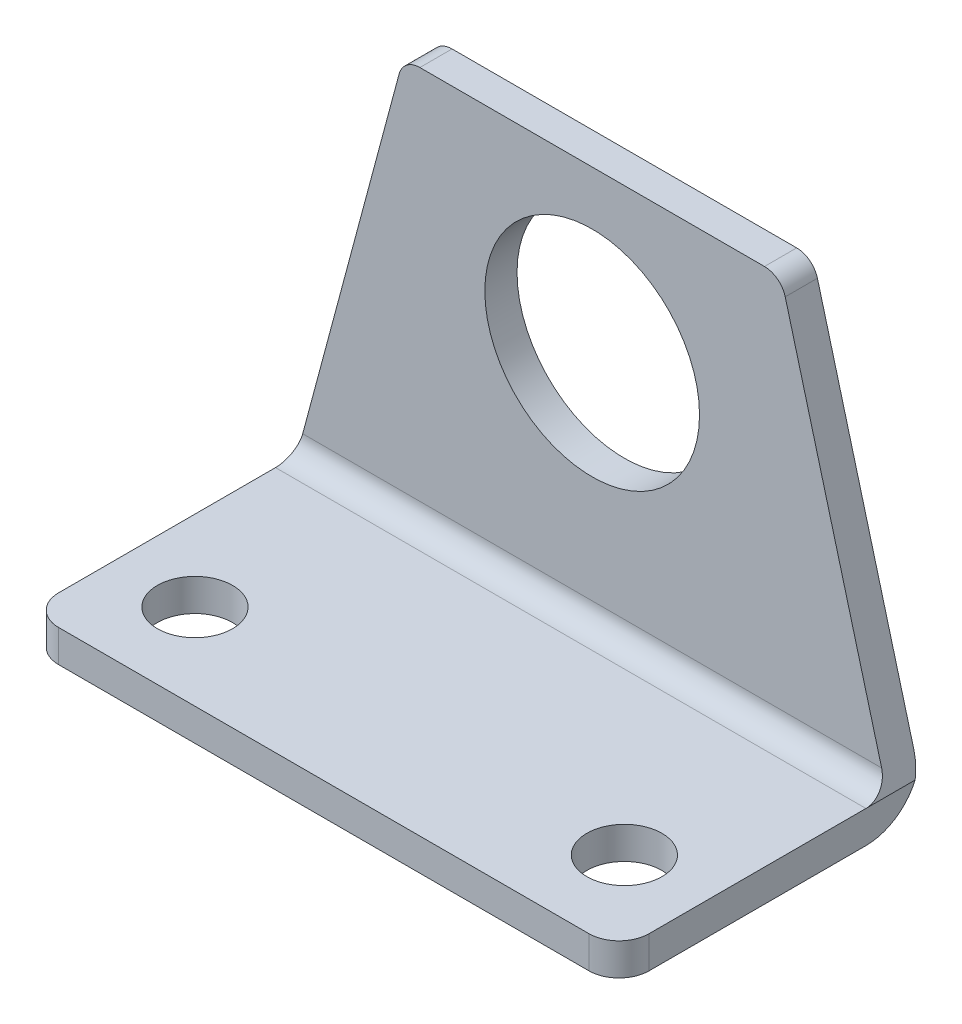
ISO-10303-21;
HEADER;
FILE_DESCRIPTION(('STEP AP214'),'2;1');
FILE_NAME('part.step','',(''),(''),'','','');
FILE_SCHEMA(('AUTOMOTIVE_DESIGN { 1 0 10303 214 1 1 1 1 }'));
ENDSEC;
DATA;
#1=APPLICATION_CONTEXT('core data for automotive mechanical design processes');
#2=APPLICATION_PROTOCOL_DEFINITION('international standard','automotive_design',2000,#1);
#3=PRODUCT_CONTEXT('',#1,'mechanical');
#4=PRODUCT('Part','Part','',(#3));
#5=PRODUCT_RELATED_PRODUCT_CATEGORY('part','',(#4));
#6=PRODUCT_DEFINITION_FORMATION('','',#4);
#7=PRODUCT_DEFINITION_CONTEXT('part definition',#1,'design');
#8=PRODUCT_DEFINITION('design','',#6,#7);
#9=PRODUCT_DEFINITION_SHAPE('','',#8);
#10=(LENGTH_UNIT() NAMED_UNIT(*) SI_UNIT(.MILLI.,.METRE.));
#11=(NAMED_UNIT(*) PLANE_ANGLE_UNIT() SI_UNIT($,.RADIAN.));
#12=(NAMED_UNIT(*) SI_UNIT($,.STERADIAN.) SOLID_ANGLE_UNIT());
#13=UNCERTAINTY_MEASURE_WITH_UNIT(LENGTH_MEASURE(1.E-05),#10,'distance_accuracy_value','');
#14=(GEOMETRIC_REPRESENTATION_CONTEXT(3) GLOBAL_UNCERTAINTY_ASSIGNED_CONTEXT((#13)) GLOBAL_UNIT_ASSIGNED_CONTEXT((#10,
#11,#12)) REPRESENTATION_CONTEXT('',''));
#15=CARTESIAN_POINT('',(0.,0.,0.));
#16=DIRECTION('',(0.,0.,1.));
#17=DIRECTION('',(1.,0.,0.));
#18=AXIS2_PLACEMENT_3D('',#15,#16,#17);
#19=CARTESIAN_POINT('',(-27.5,0.,28.));
#20=DIRECTION('',(0.,0.,1.));
#21=DIRECTION('',(1.,0.,0.));
#22=AXIS2_PLACEMENT_3D('',#19,#20,#21);
#23=PLANE('',#22);
#24=DIRECTION('',(1.,0.,0.));
#25=VECTOR('',#24,1.);
#26=CARTESIAN_POINT('',(-27.5,0.,28.));
#27=LINE('',#26,#25);
#28=CARTESIAN_POINT('',(-24.7,0.,28.));
#29=VERTEX_POINT('',#28);
#30=CARTESIAN_POINT('',(24.7,0.,28.));
#31=VERTEX_POINT('',#30);
#32=EDGE_CURVE('E166',#29,#31,#27,.T.);
#33=ORIENTED_EDGE('',*,*,#32,.T.);
#34=DIRECTION('',(0.,-1.,0.));
#35=VECTOR('',#34,1.);
#36=CARTESIAN_POINT('',(24.7,0.,28.));
#37=LINE('',#36,#35);
#38=CARTESIAN_POINT('',(24.7,3.,28.));
#39=VERTEX_POINT('',#38);
#40=EDGE_CURVE('E54',#31,#39,#37,.F.);
#41=ORIENTED_EDGE('',*,*,#40,.T.);
#42=DIRECTION('',(1.,0.,0.));
#43=VECTOR('',#42,1.);
#44=CARTESIAN_POINT('',(-27.5,3.,28.));
#45=LINE('',#44,#43);
#46=CARTESIAN_POINT('',(-24.7,3.,28.));
#47=VERTEX_POINT('',#46);
#48=EDGE_CURVE('E175',#47,#39,#45,.T.);
#49=ORIENTED_EDGE('',*,*,#48,.F.);
#50=DIRECTION('',(0.,-1.,0.));
#51=VECTOR('',#50,1.);
#52=CARTESIAN_POINT('',(-24.7,0.,28.));
#53=LINE('',#52,#51);
#54=EDGE_CURVE('E201',#47,#29,#53,.T.);
#55=ORIENTED_EDGE('',*,*,#54,.T.);
#56=EDGE_LOOP('',(#33,#41,#49,#55));
#57=FACE_BOUND('',#56,.T.);
#58=ADVANCED_FACE('F33',(#57),#23,.T.);
#59=CARTESIAN_POINT('',(-27.5,3.,28.));
#60=DIRECTION('',(0.,1.,0.));
#61=DIRECTION('',(0.,0.,1.));
#62=AXIS2_PLACEMENT_3D('',#59,#60,#61);
#63=PLANE('',#62);
#64=CARTESIAN_POINT('',(20.,3.,20.));
#65=DIRECTION('',(0.,1.,0.));
#66=DIRECTION('',(0.,0.,-1.));
#67=AXIS2_PLACEMENT_3D('',#64,#65,#66);
#68=CIRCLE('',#67,3.5);
#69=CARTESIAN_POINT('',(20.,3.,16.5));
#70=VERTEX_POINT('',#69);
#71=EDGE_CURVE('E452',#70,#70,#68,.T.);
#72=ORIENTED_EDGE('',*,*,#71,.F.);
#73=EDGE_LOOP('',(#72));
#74=FACE_BOUND('',#73,.T.);
#75=CARTESIAN_POINT('',(-20.,3.,20.));
#76=DIRECTION('',(0.,1.,0.));
#77=DIRECTION('',(0.,0.,1.));
#78=AXIS2_PLACEMENT_3D('',#75,#76,#77);
#79=CIRCLE('',#78,3.5);
#80=CARTESIAN_POINT('',(-20.,3.,23.5));
#81=VERTEX_POINT('',#80);
#82=EDGE_CURVE('E266',#81,#81,#79,.T.);
#83=ORIENTED_EDGE('',*,*,#82,.F.);
#84=EDGE_LOOP('',(#83));
#85=FACE_BOUND('',#84,.T.);
#86=ORIENTED_EDGE('',*,*,#48,.T.);
#87=CARTESIAN_POINT('',(24.7,3.,25.2));
#88=DIRECTION('',(0.,1.,0.));
#89=DIRECTION('',(0.,0.,1.));
#90=AXIS2_PLACEMENT_3D('',#87,#88,#89);
#91=CIRCLE('',#90,2.8);
#92=CARTESIAN_POINT('',(27.5,3.,25.2));
#93=VERTEX_POINT('',#92);
#94=EDGE_CURVE('E41',#39,#93,#91,.T.);
#95=ORIENTED_EDGE('',*,*,#94,.T.);
#96=DIRECTION('',(0.,0.,1.));
#97=VECTOR('',#96,1.);
#98=CARTESIAN_POINT('',(27.5,3.,28.));
#99=LINE('',#98,#97);
#100=CARTESIAN_POINT('',(27.5,3.,5.));
#101=VERTEX_POINT('',#100);
#102=EDGE_CURVE('E212',#101,#93,#99,.T.);
#103=ORIENTED_EDGE('',*,*,#102,.F.);
#104=DIRECTION('',(1.,0.,0.));
#105=VECTOR('',#104,1.);
#106=CARTESIAN_POINT('',(-27.5,3.,5.));
#107=LINE('',#106,#105);
#108=CARTESIAN_POINT('',(-27.5,3.,5.));
#109=VERTEX_POINT('',#108);
#110=EDGE_CURVE('E244',#109,#101,#107,.T.);
#111=ORIENTED_EDGE('',*,*,#110,.F.);
#112=DIRECTION('',(0.,0.,1.));
#113=VECTOR('',#112,1.);
#114=CARTESIAN_POINT('',(-27.5,3.,28.));
#115=LINE('',#114,#113);
#116=CARTESIAN_POINT('',(-27.5,3.,25.2));
#117=VERTEX_POINT('',#116);
#118=EDGE_CURVE('E171',#109,#117,#115,.T.);
#119=ORIENTED_EDGE('',*,*,#118,.T.);
#120=CARTESIAN_POINT('',(-24.7,3.,25.2));
#121=DIRECTION('',(0.,1.,0.));
#122=DIRECTION('',(0.,0.,1.));
#123=AXIS2_PLACEMENT_3D('',#120,#121,#122);
#124=CIRCLE('',#123,2.8);
#125=EDGE_CURVE('E205',#117,#47,#124,.T.);
#126=ORIENTED_EDGE('',*,*,#125,.T.);
#127=EDGE_LOOP('',(#86,#95,#103,#111,#119,#126));
#128=FACE_BOUND('',#127,.T.);
#129=ADVANCED_FACE('F210',(#74,#85,#128),#63,.T.);
#130=CARTESIAN_POINT('',(-27.5,5.,5.));
#131=DIRECTION('',(1.,0.,0.));
#132=DIRECTION('',(0.,0.,-1.));
#133=AXIS2_PLACEMENT_3D('',#130,#131,#132);
#134=CYLINDRICAL_SURFACE('',#133,2.);
#135=CARTESIAN_POINT('',(-26.9641016151378,5.,5.));
#136=DIRECTION('',(0.965925826289068,-0.258819045102521,0.));
#137=DIRECTION('',(0.258819045102521,0.965925826289068,0.));
#138=AXIS2_PLACEMENT_3D('',#135,#136,#137);
#139=ELLIPSE('',#138,2.07055236082017,2.);
#140=CARTESIAN_POINT('',(-26.9641016151378,5.,3.));
#141=VERTEX_POINT('',#140);
#142=EDGE_CURVE('E275',#109,#141,#139,.T.);
#143=ORIENTED_EDGE('',*,*,#142,.F.);
#144=ORIENTED_EDGE('',*,*,#110,.T.);
#145=CARTESIAN_POINT('',(26.9641016151377,5.,5.));
#146=DIRECTION('',(-0.965925826289068,-0.258819045102521,0.));
#147=DIRECTION('',(0.258819045102521,-0.965925826289068,0.));
#148=AXIS2_PLACEMENT_3D('',#145,#146,#147);
#149=ELLIPSE('',#148,2.07055236082017,2.);
#150=CARTESIAN_POINT('',(26.9641016151377,5.,3.));
#151=VERTEX_POINT('',#150);
#152=EDGE_CURVE('E153',#151,#101,#149,.T.);
#153=ORIENTED_EDGE('',*,*,#152,.F.);
#154=DIRECTION('',(1.,0.,0.));
#155=VECTOR('',#154,1.);
#156=CARTESIAN_POINT('',(-27.5,5.,3.));
#157=LINE('',#156,#155);
#158=EDGE_CURVE('E246',#141,#151,#157,.T.);
#159=ORIENTED_EDGE('',*,*,#158,.F.);
#160=EDGE_LOOP('',(#143,#144,#153,#159));
#161=FACE_BOUND('',#160,.T.);
#162=ADVANCED_FACE('F285',(#161),#134,.F.);
#163=CARTESIAN_POINT('',(-27.5,5.,3.));
#164=DIRECTION('',(0.,0.,1.));
#165=DIRECTION('',(1.,0.,0.));
#166=AXIS2_PLACEMENT_3D('',#163,#164,#165);
#167=PLANE('',#166);
#168=DIRECTION('',(0.258819045102521,-0.965925826289068,0.));
#169=VECTOR('',#168,1.);
#170=CARTESIAN_POINT('',(23.315698604072,18.6160254037845,3.));
#171=LINE('',#170,#169);
#172=CARTESIAN_POINT('',(17.9830775566686,38.517638090205,3.));
#173=VERTEX_POINT('',#172);
#174=EDGE_CURVE('E271',#173,#151,#171,.T.);
#175=ORIENTED_EDGE('',*,*,#174,.F.);
#176=CARTESIAN_POINT('',(16.0512259040905,38.,3.));
#177=DIRECTION('',(0.,0.,1.));
#178=DIRECTION('',(1.,0.,0.));
#179=AXIS2_PLACEMENT_3D('',#176,#177,#178);
#180=CIRCLE('',#179,2.);
#181=CARTESIAN_POINT('',(16.0512259040905,40.,3.));
#182=VERTEX_POINT('',#181);
#183=EDGE_CURVE('E182',#173,#182,#180,.T.);
#184=ORIENTED_EDGE('',*,*,#183,.T.);
#185=DIRECTION('',(1.,0.,0.));
#186=VECTOR('',#185,1.);
#187=CARTESIAN_POINT('',(-27.5,40.,3.));
#188=LINE('',#187,#186);
#189=CARTESIAN_POINT('',(-16.0512259040905,40.,3.));
#190=VERTEX_POINT('',#189);
#191=EDGE_CURVE('E163',#190,#182,#188,.T.);
#192=ORIENTED_EDGE('',*,*,#191,.F.);
#193=CARTESIAN_POINT('',(-16.0512259040905,38.,3.));
#194=DIRECTION('',(0.,0.,1.));
#195=DIRECTION('',(1.,0.,0.));
#196=AXIS2_PLACEMENT_3D('',#193,#194,#195);
#197=CIRCLE('',#196,2.);
#198=CARTESIAN_POINT('',(-17.9830775566687,38.5176380902051,3.));
#199=VERTEX_POINT('',#198);
#200=EDGE_CURVE('E180',#190,#199,#197,.T.);
#201=ORIENTED_EDGE('',*,*,#200,.T.);
#202=DIRECTION('',(0.258819045102521,0.965925826289068,0.));
#203=VECTOR('',#202,1.);
#204=CARTESIAN_POINT('',(-27.,4.86602540378444,3.));
#205=LINE('',#204,#203);
#206=EDGE_CURVE('E152',#141,#199,#205,.T.);
#207=ORIENTED_EDGE('',*,*,#206,.F.);
#208=ORIENTED_EDGE('',*,*,#158,.T.);
#209=EDGE_LOOP('',(#175,#184,#192,#201,#207,#208));
#210=FACE_BOUND('',#209,.T.);
#211=CARTESIAN_POINT('',(0.,25.,3.));
#212=DIRECTION('',(0.,0.,1.));
#213=DIRECTION('',(1.,0.,0.));
#214=AXIS2_PLACEMENT_3D('',#211,#212,#213);
#215=CIRCLE('',#214,10.);
#216=CARTESIAN_POINT('',(10.,25.,3.));
#217=VERTEX_POINT('',#216);
#218=EDGE_CURVE('E236',#217,#217,#215,.T.);
#219=ORIENTED_EDGE('',*,*,#218,.F.);
#220=EDGE_LOOP('',(#219));
#221=FACE_BOUND('',#220,.T.);
#222=ADVANCED_FACE('F283',(#210,#221),#167,.T.);
#223=CARTESIAN_POINT('',(-27.5,40.,3.));
#224=DIRECTION('',(0.,1.,0.));
#225=DIRECTION('',(0.,0.,1.));
#226=AXIS2_PLACEMENT_3D('',#223,#224,#225);
#227=PLANE('',#226);
#228=ORIENTED_EDGE('',*,*,#191,.T.);
#229=DIRECTION('',(0.,0.,1.));
#230=VECTOR('',#229,1.);
#231=CARTESIAN_POINT('',(16.0512259040905,40.,0.));
#232=LINE('',#231,#230);
#233=CARTESIAN_POINT('',(16.0512259040905,40.,0.));
#234=VERTEX_POINT('',#233);
#235=EDGE_CURVE('E187',#182,#234,#232,.F.);
#236=ORIENTED_EDGE('',*,*,#235,.T.);
#237=DIRECTION('',(1.,0.,0.));
#238=VECTOR('',#237,1.);
#239=CARTESIAN_POINT('',(-27.5,40.,0.));
#240=LINE('',#239,#238);
#241=CARTESIAN_POINT('',(-16.0512259040905,40.,0.));
#242=VERTEX_POINT('',#241);
#243=EDGE_CURVE('E160',#242,#234,#240,.T.);
#244=ORIENTED_EDGE('',*,*,#243,.F.);
#245=DIRECTION('',(0.,0.,1.));
#246=VECTOR('',#245,1.);
#247=CARTESIAN_POINT('',(-16.0512259040905,40.,3.));
#248=LINE('',#247,#246);
#249=EDGE_CURVE('E184',#242,#190,#248,.T.);
#250=ORIENTED_EDGE('',*,*,#249,.T.);
#251=EDGE_LOOP('',(#228,#236,#244,#250));
#252=FACE_BOUND('',#251,.T.);
#253=ADVANCED_FACE('F252',(#252),#227,.T.);
#254=CARTESIAN_POINT('',(-27.5,5.,0.));
#255=DIRECTION('',(0.,0.,-1.));
#256=DIRECTION('',(-1.,0.,0.));
#257=AXIS2_PLACEMENT_3D('',#254,#255,#256);
#258=PLANE('',#257);
#259=ORIENTED_EDGE('',*,*,#243,.T.);
#260=CARTESIAN_POINT('',(16.0512259040905,38.,0.));
#261=DIRECTION('',(0.,0.,-1.));
#262=DIRECTION('',(-1.,0.,0.));
#263=AXIS2_PLACEMENT_3D('',#260,#261,#262);
#264=CIRCLE('',#263,2.);
#265=CARTESIAN_POINT('',(17.9830775566687,38.517638090205,0.));
#266=VERTEX_POINT('',#265);
#267=EDGE_CURVE('E191',#234,#266,#264,.T.);
#268=ORIENTED_EDGE('',*,*,#267,.T.);
#269=DIRECTION('',(0.258819045102521,-0.965925826289068,0.));
#270=VECTOR('',#269,1.);
#271=CARTESIAN_POINT('',(17.5858798800484,40.,0.));
#272=LINE('',#271,#270);
#273=CARTESIAN_POINT('',(26.9641016151377,5.,0.));
#274=VERTEX_POINT('',#273);
#275=EDGE_CURVE('E141',#266,#274,#272,.T.);
#276=ORIENTED_EDGE('',*,*,#275,.T.);
#277=DIRECTION('',(1.,0.,0.));
#278=VECTOR('',#277,1.);
#279=CARTESIAN_POINT('',(-27.5,5.,0.));
#280=LINE('',#279,#278);
#281=CARTESIAN_POINT('',(-26.9641016151377,5.,0.));
#282=VERTEX_POINT('',#281);
#283=EDGE_CURVE('E148',#282,#274,#280,.T.);
#284=ORIENTED_EDGE('',*,*,#283,.F.);
#285=DIRECTION('',(0.258819045102521,0.965925826289068,0.));
#286=VECTOR('',#285,1.);
#287=CARTESIAN_POINT('',(-17.5858798800484,40.,0.));
#288=LINE('',#287,#286);
#289=CARTESIAN_POINT('',(-17.9830775566687,38.517638090205,0.));
#290=VERTEX_POINT('',#289);
#291=EDGE_CURVE('E129',#282,#290,#288,.T.);
#292=ORIENTED_EDGE('',*,*,#291,.T.);
#293=CARTESIAN_POINT('',(-16.0512259040905,38.,0.));
#294=DIRECTION('',(0.,0.,-1.));
#295=DIRECTION('',(-1.,0.,0.));
#296=AXIS2_PLACEMENT_3D('',#293,#294,#295);
#297=CIRCLE('',#296,2.);
#298=EDGE_CURVE('E189',#290,#242,#297,.T.);
#299=ORIENTED_EDGE('',*,*,#298,.T.);
#300=EDGE_LOOP('',(#259,#268,#276,#284,#292,#299));
#301=FACE_BOUND('',#300,.T.);
#302=CARTESIAN_POINT('',(0.,25.,0.));
#303=DIRECTION('',(0.,0.,1.));
#304=DIRECTION('',(1.,0.,0.));
#305=AXIS2_PLACEMENT_3D('',#302,#303,#304);
#306=CIRCLE('',#305,10.);
#307=CARTESIAN_POINT('',(10.,25.,0.));
#308=VERTEX_POINT('',#307);
#309=EDGE_CURVE('E241',#308,#308,#306,.T.);
#310=ORIENTED_EDGE('',*,*,#309,.T.);
#311=EDGE_LOOP('',(#310));
#312=FACE_BOUND('',#311,.T.);
#313=ADVANCED_FACE('F156',(#301,#312),#258,.T.);
#314=CARTESIAN_POINT('',(-27.5,5.,5.));
#315=DIRECTION('',(1.,0.,0.));
#316=DIRECTION('',(0.,0.,-1.));
#317=AXIS2_PLACEMENT_3D('',#314,#315,#316);
#318=CYLINDRICAL_SURFACE('',#317,5.);
#319=CARTESIAN_POINT('',(-26.9641016151378,5.,5.));
#320=DIRECTION('',(0.965925826289068,-0.258819045102521,0.));
#321=DIRECTION('',(0.258819045102521,0.965925826289068,0.));
#322=AXIS2_PLACEMENT_3D('',#319,#320,#321);
#323=ELLIPSE('',#322,5.17638090205041,5.);
#324=CARTESIAN_POINT('',(-27.5,3.,0.417424305044161));
#325=VERTEX_POINT('',#324);
#326=EDGE_CURVE('E133',#282,#325,#323,.F.);
#327=ORIENTED_EDGE('',*,*,#326,.F.);
#328=ORIENTED_EDGE('',*,*,#283,.T.);
#329=CARTESIAN_POINT('',(26.9641016151377,5.,5.));
#330=DIRECTION('',(-0.965925826289068,-0.258819045102521,0.));
#331=DIRECTION('',(0.258819045102521,-0.965925826289068,0.));
#332=AXIS2_PLACEMENT_3D('',#329,#330,#331);
#333=ELLIPSE('',#332,5.17638090205041,5.);
#334=CARTESIAN_POINT('',(27.5,3.,0.417424305044161));
#335=VERTEX_POINT('',#334);
#336=EDGE_CURVE('E140',#335,#274,#333,.F.);
#337=ORIENTED_EDGE('',*,*,#336,.F.);
#338=CARTESIAN_POINT('',(27.5,5.,5.));
#339=DIRECTION('',(1.,0.,0.));
#340=DIRECTION('',(0.,0.,-1.));
#341=AXIS2_PLACEMENT_3D('',#338,#339,#340);
#342=CIRCLE('',#341,5.);
#343=CARTESIAN_POINT('',(27.5,0.,5.));
#344=VERTEX_POINT('',#343);
#345=EDGE_CURVE('E222',#344,#335,#342,.T.);
#346=ORIENTED_EDGE('',*,*,#345,.F.);
#347=DIRECTION('',(1.,0.,0.));
#348=VECTOR('',#347,1.);
#349=CARTESIAN_POINT('',(-27.5,0.,5.));
#350=LINE('',#349,#348);
#351=CARTESIAN_POINT('',(-27.5,0.,5.));
#352=VERTEX_POINT('',#351);
#353=EDGE_CURVE('E161',#352,#344,#350,.T.);
#354=ORIENTED_EDGE('',*,*,#353,.F.);
#355=CARTESIAN_POINT('',(-27.5,5.,5.));
#356=DIRECTION('',(1.,0.,0.));
#357=DIRECTION('',(0.,0.,-1.));
#358=AXIS2_PLACEMENT_3D('',#355,#356,#357);
#359=CIRCLE('',#358,5.);
#360=EDGE_CURVE('E151',#352,#325,#359,.T.);
#361=ORIENTED_EDGE('',*,*,#360,.T.);
#362=EDGE_LOOP('',(#327,#328,#337,#346,#354,#361));
#363=FACE_BOUND('',#362,.T.);
#364=ADVANCED_FACE('F146',(#363),#318,.T.);
#365=CARTESIAN_POINT('',(-27.5,0.,28.));
#366=DIRECTION('',(0.,-1.,0.));
#367=DIRECTION('',(0.,0.,-1.));
#368=AXIS2_PLACEMENT_3D('',#365,#366,#367);
#369=PLANE('',#368);
#370=CARTESIAN_POINT('',(20.,0.,20.));
#371=DIRECTION('',(0.,1.,0.));
#372=DIRECTION('',(0.,0.,-1.));
#373=AXIS2_PLACEMENT_3D('',#370,#371,#372);
#374=CIRCLE('',#373,3.5);
#375=CARTESIAN_POINT('',(20.,0.,16.5));
#376=VERTEX_POINT('',#375);
#377=EDGE_CURVE('E450',#376,#376,#374,.T.);
#378=ORIENTED_EDGE('',*,*,#377,.T.);
#379=EDGE_LOOP('',(#378));
#380=FACE_BOUND('',#379,.T.);
#381=CARTESIAN_POINT('',(-20.,0.,20.));
#382=DIRECTION('',(0.,1.,0.));
#383=DIRECTION('',(0.,0.,1.));
#384=AXIS2_PLACEMENT_3D('',#381,#382,#383);
#385=CIRCLE('',#384,3.5);
#386=CARTESIAN_POINT('',(-20.,0.,23.5));
#387=VERTEX_POINT('',#386);
#388=EDGE_CURVE('E263',#387,#387,#385,.T.);
#389=ORIENTED_EDGE('',*,*,#388,.T.);
#390=EDGE_LOOP('',(#389));
#391=FACE_BOUND('',#390,.T.);
#392=DIRECTION('',(0.,0.,-1.));
#393=VECTOR('',#392,1.);
#394=CARTESIAN_POINT('',(27.5,0.,28.));
#395=LINE('',#394,#393);
#396=CARTESIAN_POINT('',(27.5,0.,25.2));
#397=VERTEX_POINT('',#396);
#398=EDGE_CURVE('E228',#397,#344,#395,.T.);
#399=ORIENTED_EDGE('',*,*,#398,.F.);
#400=CARTESIAN_POINT('',(24.7,0.,25.2));
#401=DIRECTION('',(0.,-1.,0.));
#402=DIRECTION('',(0.,0.,-1.));
#403=AXIS2_PLACEMENT_3D('',#400,#401,#402);
#404=CIRCLE('',#403,2.8);
#405=EDGE_CURVE('E199',#397,#31,#404,.T.);
#406=ORIENTED_EDGE('',*,*,#405,.T.);
#407=ORIENTED_EDGE('',*,*,#32,.F.);
#408=CARTESIAN_POINT('',(-24.7,0.,25.2));
#409=DIRECTION('',(0.,-1.,0.));
#410=DIRECTION('',(0.,0.,-1.));
#411=AXIS2_PLACEMENT_3D('',#408,#409,#410);
#412=CIRCLE('',#411,2.8);
#413=CARTESIAN_POINT('',(-27.5,0.,25.2));
#414=VERTEX_POINT('',#413);
#415=EDGE_CURVE('E197',#29,#414,#412,.T.);
#416=ORIENTED_EDGE('',*,*,#415,.T.);
#417=DIRECTION('',(0.,0.,-1.));
#418=VECTOR('',#417,1.);
#419=CARTESIAN_POINT('',(-27.5,0.,28.));
#420=LINE('',#419,#418);
#421=EDGE_CURVE('E221',#414,#352,#420,.T.);
#422=ORIENTED_EDGE('',*,*,#421,.T.);
#423=ORIENTED_EDGE('',*,*,#353,.T.);
#424=EDGE_LOOP('',(#399,#406,#407,#416,#422,#423));
#425=FACE_BOUND('',#424,.T.);
#426=ADVANCED_FACE('F227',(#380,#391,#425),#369,.T.);
#427=CARTESIAN_POINT('',(-27.5,5.,5.));
#428=DIRECTION('',(1.,0.,0.));
#429=DIRECTION('',(0.,0.,-1.));
#430=AXIS2_PLACEMENT_3D('',#427,#428,#429);
#431=PLANE('',#430);
#432=ORIENTED_EDGE('',*,*,#421,.F.);
#433=DIRECTION('',(0.,-1.,0.));
#434=VECTOR('',#433,1.);
#435=CARTESIAN_POINT('',(-27.5,3.,25.2));
#436=LINE('',#435,#434);
#437=EDGE_CURVE('E11',#414,#117,#436,.F.);
#438=ORIENTED_EDGE('',*,*,#437,.T.);
#439=ORIENTED_EDGE('',*,*,#118,.F.);
#440=DIRECTION('',(0.,0.,-1.));
#441=VECTOR('',#440,1.);
#442=CARTESIAN_POINT('',(-27.5,3.,5.));
#443=LINE('',#442,#441);
#444=EDGE_CURVE('E174',#109,#325,#443,.T.);
#445=ORIENTED_EDGE('',*,*,#444,.T.);
#446=ORIENTED_EDGE('',*,*,#360,.F.);
#447=EDGE_LOOP('',(#432,#438,#439,#445,#446));
#448=FACE_BOUND('',#447,.T.);
#449=ADVANCED_FACE('F232',(#448),#431,.F.);
#450=CARTESIAN_POINT('',(27.5,5.,5.));
#451=DIRECTION('',(1.,0.,0.));
#452=DIRECTION('',(0.,0.,-1.));
#453=AXIS2_PLACEMENT_3D('',#450,#451,#452);
#454=PLANE('',#453);
#455=ORIENTED_EDGE('',*,*,#102,.T.);
#456=DIRECTION('',(0.,-1.,0.));
#457=VECTOR('',#456,1.);
#458=CARTESIAN_POINT('',(27.5,5.,25.2));
#459=LINE('',#458,#457);
#460=EDGE_CURVE('E194',#93,#397,#459,.T.);
#461=ORIENTED_EDGE('',*,*,#460,.T.);
#462=ORIENTED_EDGE('',*,*,#398,.T.);
#463=ORIENTED_EDGE('',*,*,#345,.T.);
#464=DIRECTION('',(0.,0.,-1.));
#465=VECTOR('',#464,1.);
#466=CARTESIAN_POINT('',(27.5,3.,5.));
#467=LINE('',#466,#465);
#468=EDGE_CURVE('E172',#101,#335,#467,.T.);
#469=ORIENTED_EDGE('',*,*,#468,.F.);
#470=EDGE_LOOP('',(#455,#461,#462,#463,#469));
#471=FACE_BOUND('',#470,.T.);
#472=ADVANCED_FACE('F217',(#471),#454,.T.);
#473=CARTESIAN_POINT('',(0.,25.,0.));
#474=DIRECTION('',(0.,0.,1.));
#475=DIRECTION('',(1.,0.,0.));
#476=AXIS2_PLACEMENT_3D('',#473,#474,#475);
#477=CYLINDRICAL_SURFACE('',#476,10.);
#478=ORIENTED_EDGE('',*,*,#309,.F.);
#479=EDGE_LOOP('',(#478));
#480=FACE_BOUND('',#479,.T.);
#481=ORIENTED_EDGE('',*,*,#218,.T.);
#482=EDGE_LOOP('',(#481));
#483=FACE_BOUND('',#482,.T.);
#484=ADVANCED_FACE('F281',(#480,#483),#477,.F.);
#485=CARTESIAN_POINT('',(17.5858798800484,40.,0.));
#486=DIRECTION('',(-0.965925826289068,-0.258819045102521,0.));
#487=DIRECTION('',(0.258819045102521,-0.965925826289068,0.));
#488=AXIS2_PLACEMENT_3D('',#485,#486,#487);
#489=PLANE('',#488);
#490=ORIENTED_EDGE('',*,*,#275,.F.);
#491=DIRECTION('',(0.,0.,1.));
#492=VECTOR('',#491,1.);
#493=CARTESIAN_POINT('',(17.9830775566687,38.517638090205,3.));
#494=LINE('',#493,#492);
#495=EDGE_CURVE('E177',#266,#173,#494,.T.);
#496=ORIENTED_EDGE('',*,*,#495,.T.);
#497=ORIENTED_EDGE('',*,*,#174,.T.);
#498=ORIENTED_EDGE('',*,*,#152,.T.);
#499=ORIENTED_EDGE('',*,*,#468,.T.);
#500=ORIENTED_EDGE('',*,*,#336,.T.);
#501=EDGE_LOOP('',(#490,#496,#497,#498,#499,#500));
#502=FACE_BOUND('',#501,.T.);
#503=ADVANCED_FACE('F261',(#502),#489,.F.);
#504=CARTESIAN_POINT('',(-17.5858798800484,40.,0.));
#505=DIRECTION('',(0.965925826289068,-0.258819045102521,0.));
#506=DIRECTION('',(0.258819045102521,0.965925826289068,0.));
#507=AXIS2_PLACEMENT_3D('',#504,#505,#506);
#508=PLANE('',#507);
#509=ORIENTED_EDGE('',*,*,#206,.T.);
#510=DIRECTION('',(0.,0.,1.));
#511=VECTOR('',#510,1.);
#512=CARTESIAN_POINT('',(-17.9830775566687,38.517638090205,0.));
#513=LINE('',#512,#511);
#514=EDGE_CURVE('E136',#199,#290,#513,.F.);
#515=ORIENTED_EDGE('',*,*,#514,.T.);
#516=ORIENTED_EDGE('',*,*,#291,.F.);
#517=ORIENTED_EDGE('',*,*,#326,.T.);
#518=ORIENTED_EDGE('',*,*,#444,.F.);
#519=ORIENTED_EDGE('',*,*,#142,.T.);
#520=EDGE_LOOP('',(#509,#515,#516,#517,#518,#519));
#521=FACE_BOUND('',#520,.T.);
#522=ADVANCED_FACE('F132',(#521),#508,.F.);
#523=CARTESIAN_POINT('',(-20.,0.,20.));
#524=DIRECTION('',(0.,1.,0.));
#525=DIRECTION('',(0.,0.,1.));
#526=AXIS2_PLACEMENT_3D('',#523,#524,#525);
#527=CYLINDRICAL_SURFACE('',#526,3.5);
#528=ORIENTED_EDGE('',*,*,#388,.F.);
#529=EDGE_LOOP('',(#528));
#530=FACE_BOUND('',#529,.T.);
#531=ORIENTED_EDGE('',*,*,#82,.T.);
#532=EDGE_LOOP('',(#531));
#533=FACE_BOUND('',#532,.T.);
#534=ADVANCED_FACE('F382',(#530,#533),#527,.F.);
#535=CARTESIAN_POINT('',(20.,0.,20.));
#536=DIRECTION('',(0.,1.,0.));
#537=DIRECTION('',(0.,0.,1.));
#538=AXIS2_PLACEMENT_3D('',#535,#536,#537);
#539=CYLINDRICAL_SURFACE('',#538,3.5);
#540=ORIENTED_EDGE('',*,*,#377,.F.);
#541=EDGE_LOOP('',(#540));
#542=FACE_BOUND('',#541,.T.);
#543=ORIENTED_EDGE('',*,*,#71,.T.);
#544=EDGE_LOOP('',(#543));
#545=FACE_BOUND('',#544,.T.);
#546=ADVANCED_FACE('F307',(#542,#545),#539,.F.);
#547=CARTESIAN_POINT('',(16.0512259040905,38.,0.));
#548=DIRECTION('',(0.,0.,-1.));
#549=DIRECTION('',(-1.,0.,0.));
#550=AXIS2_PLACEMENT_3D('',#547,#548,#549);
#551=CYLINDRICAL_SURFACE('',#550,2.);
#552=ORIENTED_EDGE('',*,*,#267,.F.);
#553=ORIENTED_EDGE('',*,*,#235,.F.);
#554=ORIENTED_EDGE('',*,*,#183,.F.);
#555=ORIENTED_EDGE('',*,*,#495,.F.);
#556=EDGE_LOOP('',(#552,#553,#554,#555));
#557=FACE_BOUND('',#556,.T.);
#558=ADVANCED_FACE('F258',(#557),#551,.T.);
#559=CARTESIAN_POINT('',(-16.0512259040905,38.,3.));
#560=DIRECTION('',(0.,0.,-1.));
#561=DIRECTION('',(-1.,0.,0.));
#562=AXIS2_PLACEMENT_3D('',#559,#560,#561);
#563=CYLINDRICAL_SURFACE('',#562,2.);
#564=ORIENTED_EDGE('',*,*,#298,.F.);
#565=ORIENTED_EDGE('',*,*,#514,.F.);
#566=ORIENTED_EDGE('',*,*,#200,.F.);
#567=ORIENTED_EDGE('',*,*,#249,.F.);
#568=EDGE_LOOP('',(#564,#565,#566,#567));
#569=FACE_BOUND('',#568,.T.);
#570=ADVANCED_FACE('F306',(#569),#563,.T.);
#571=CARTESIAN_POINT('',(24.7,5.,25.2));
#572=DIRECTION('',(0.,-1.,0.));
#573=DIRECTION('',(0.,0.,-1.));
#574=AXIS2_PLACEMENT_3D('',#571,#572,#573);
#575=CYLINDRICAL_SURFACE('',#574,2.8);
#576=ORIENTED_EDGE('',*,*,#94,.F.);
#577=ORIENTED_EDGE('',*,*,#40,.F.);
#578=ORIENTED_EDGE('',*,*,#405,.F.);
#579=ORIENTED_EDGE('',*,*,#460,.F.);
#580=EDGE_LOOP('',(#576,#577,#578,#579));
#581=FACE_BOUND('',#580,.T.);
#582=ADVANCED_FACE('F224',(#581),#575,.T.);
#583=CARTESIAN_POINT('',(-24.7,0.,25.2));
#584=DIRECTION('',(0.,1.,0.));
#585=DIRECTION('',(0.,0.,1.));
#586=AXIS2_PLACEMENT_3D('',#583,#584,#585);
#587=CYLINDRICAL_SURFACE('',#586,2.8);
#588=ORIENTED_EDGE('',*,*,#125,.F.);
#589=ORIENTED_EDGE('',*,*,#437,.F.);
#590=ORIENTED_EDGE('',*,*,#415,.F.);
#591=ORIENTED_EDGE('',*,*,#54,.F.);
#592=EDGE_LOOP('',(#588,#589,#590,#591));
#593=FACE_BOUND('',#592,.T.);
#594=ADVANCED_FACE('F35',(#593),#587,.T.);
#595=CLOSED_SHELL('',(#58,#129,#162,#222,#253,#313,#364,#426,#449,#472,#484,#503,#522,#534,#546,
#558,#570,#582,#594));
#596=MANIFOLD_SOLID_BREP('B2',#595);
#597=ADVANCED_BREP_SHAPE_REPRESENTATION('',(#18,#596),#14);
#598=SHAPE_DEFINITION_REPRESENTATION(#9,#597);
ENDSEC;
END-ISO-10303-21;
